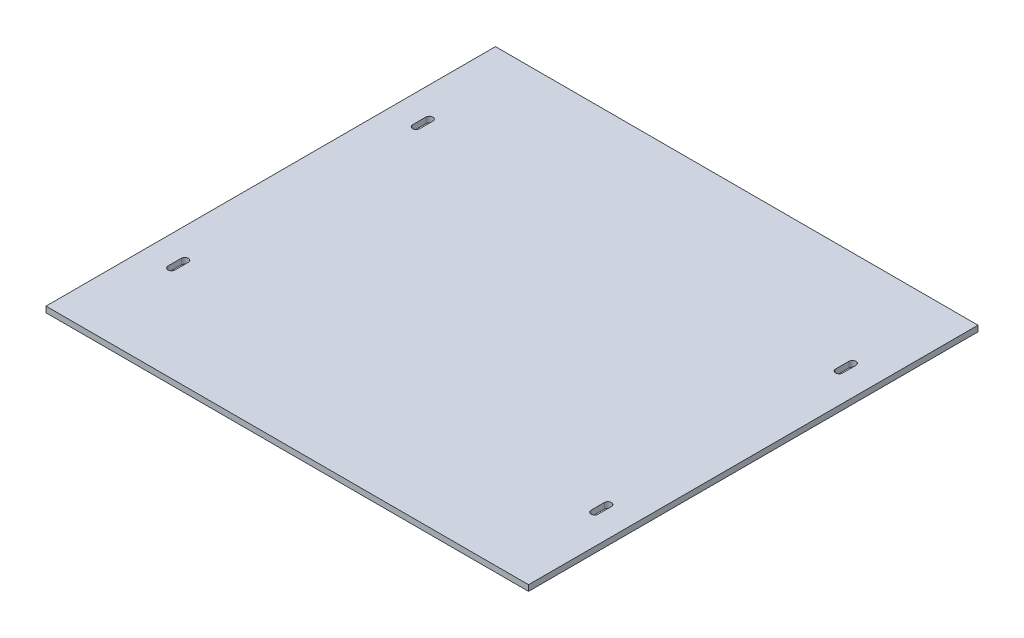
ISO-10303-21;
HEADER;
FILE_DESCRIPTION(('STEP AP214'),'2;1');
FILE_NAME('part.step','',(''),(''),'','','');
FILE_SCHEMA(('AUTOMOTIVE_DESIGN { 1 0 10303 214 1 1 1 1 }'));
ENDSEC;
DATA;
#1=APPLICATION_CONTEXT('core data for automotive mechanical design processes');
#2=APPLICATION_PROTOCOL_DEFINITION('international standard','automotive_design',2000,#1);
#3=PRODUCT_CONTEXT('',#1,'mechanical');
#4=PRODUCT('Part','Part','',(#3));
#5=PRODUCT_RELATED_PRODUCT_CATEGORY('part','',(#4));
#6=PRODUCT_DEFINITION_FORMATION('','',#4);
#7=PRODUCT_DEFINITION_CONTEXT('part definition',#1,'design');
#8=PRODUCT_DEFINITION('design','',#6,#7);
#9=PRODUCT_DEFINITION_SHAPE('','',#8);
#10=(LENGTH_UNIT() NAMED_UNIT(*) SI_UNIT(.MILLI.,.METRE.));
#11=(NAMED_UNIT(*) PLANE_ANGLE_UNIT() SI_UNIT($,.RADIAN.));
#12=(NAMED_UNIT(*) SI_UNIT($,.STERADIAN.) SOLID_ANGLE_UNIT());
#13=UNCERTAINTY_MEASURE_WITH_UNIT(LENGTH_MEASURE(1.E-05),#10,'distance_accuracy_value','');
#14=(GEOMETRIC_REPRESENTATION_CONTEXT(3) GLOBAL_UNCERTAINTY_ASSIGNED_CONTEXT((#13)) GLOBAL_UNIT_ASSIGNED_CONTEXT((#10,
#11,#12)) REPRESENTATION_CONTEXT('',''));
#15=CARTESIAN_POINT('',(0.,0.,0.));
#16=DIRECTION('',(0.,0.,1.));
#17=DIRECTION('',(1.,0.,0.));
#18=AXIS2_PLACEMENT_3D('',#15,#16,#17);
#19=CARTESIAN_POINT('',(0.,5.588,0.));
#20=DIRECTION('',(0.,-1.,0.));
#21=DIRECTION('',(0.,0.,-1.));
#22=AXIS2_PLACEMENT_3D('',#19,#20,#21);
#23=PLANE('',#22);
#24=CARTESIAN_POINT('',(434.975,5.588,-92.0749999999998));
#25=DIRECTION('',(0.,1.,0.));
#26=DIRECTION('',(0.,0.,1.));
#27=AXIS2_PLACEMENT_3D('',#24,#25,#26);
#28=CIRCLE('',#27,3.3782);
#29=CARTESIAN_POINT('',(431.5968,5.588,-92.0749999999998));
#30=VERTEX_POINT('',#29);
#31=CARTESIAN_POINT('',(438.3532,5.588,-92.0749999999998));
#32=VERTEX_POINT('',#31);
#33=EDGE_CURVE('E206',#30,#32,#28,.T.);
#34=ORIENTED_EDGE('',*,*,#33,.F.);
#35=DIRECTION('',(0.,0.,1.));
#36=VECTOR('',#35,1.);
#37=CARTESIAN_POINT('',(431.5968,5.588,-92.0749999999998));
#38=LINE('',#37,#36);
#39=CARTESIAN_POINT('',(431.5968,5.588,-104.775));
#40=VERTEX_POINT('',#39);
#41=EDGE_CURVE('E214',#40,#30,#38,.T.);
#42=ORIENTED_EDGE('',*,*,#41,.F.);
#43=CARTESIAN_POINT('',(434.975,5.588,-104.775));
#44=DIRECTION('',(0.,1.,0.));
#45=DIRECTION('',(0.,0.,1.));
#46=AXIS2_PLACEMENT_3D('',#43,#44,#45);
#47=CIRCLE('',#46,3.3782);
#48=CARTESIAN_POINT('',(438.3532,5.588,-104.775));
#49=VERTEX_POINT('',#48);
#50=EDGE_CURVE('E211',#49,#40,#47,.T.);
#51=ORIENTED_EDGE('',*,*,#50,.F.);
#52=DIRECTION('',(0.,0.,-1.));
#53=VECTOR('',#52,1.);
#54=CARTESIAN_POINT('',(438.3532,5.588,-92.0749999999998));
#55=LINE('',#54,#53);
#56=EDGE_CURVE('E208',#32,#49,#55,.T.);
#57=ORIENTED_EDGE('',*,*,#56,.F.);
#58=EDGE_LOOP('',(#34,#42,#51,#57));
#59=FACE_BOUND('',#58,.T.);
#60=CARTESIAN_POINT('',(28.575,5.588,-339.725));
#61=DIRECTION('',(0.,1.,0.));
#62=DIRECTION('',(0.,0.,1.));
#63=AXIS2_PLACEMENT_3D('',#60,#61,#62);
#64=CIRCLE('',#63,3.37819999999998);
#65=CARTESIAN_POINT('',(31.9532,5.588,-339.725));
#66=VERTEX_POINT('',#65);
#67=CARTESIAN_POINT('',(25.1968,5.588,-339.725));
#68=VERTEX_POINT('',#67);
#69=EDGE_CURVE('E268',#66,#68,#64,.T.);
#70=ORIENTED_EDGE('',*,*,#69,.F.);
#71=DIRECTION('',(0.,0.,-1.));
#72=VECTOR('',#71,1.);
#73=CARTESIAN_POINT('',(31.9532,5.588,-339.725));
#74=LINE('',#73,#72);
#75=CARTESIAN_POINT('',(31.9532,5.588,-327.025));
#76=VERTEX_POINT('',#75);
#77=EDGE_CURVE('E276',#76,#66,#74,.T.);
#78=ORIENTED_EDGE('',*,*,#77,.F.);
#79=CARTESIAN_POINT('',(28.575,5.588,-327.025));
#80=DIRECTION('',(0.,1.,0.));
#81=DIRECTION('',(0.,0.,1.));
#82=AXIS2_PLACEMENT_3D('',#79,#80,#81);
#83=CIRCLE('',#82,3.37819999999998);
#84=CARTESIAN_POINT('',(25.1968,5.588,-327.025));
#85=VERTEX_POINT('',#84);
#86=EDGE_CURVE('E273',#85,#76,#83,.T.);
#87=ORIENTED_EDGE('',*,*,#86,.F.);
#88=DIRECTION('',(0.,0.,1.));
#89=VECTOR('',#88,1.);
#90=CARTESIAN_POINT('',(25.1968,5.588,-339.725));
#91=LINE('',#90,#89);
#92=EDGE_CURVE('E270',#68,#85,#91,.T.);
#93=ORIENTED_EDGE('',*,*,#92,.F.);
#94=EDGE_LOOP('',(#70,#78,#87,#93));
#95=FACE_BOUND('',#94,.T.);
#96=DIRECTION('',(0.,0.,1.));
#97=VECTOR('',#96,1.);
#98=CARTESIAN_POINT('',(0.,5.588,0.));
#99=LINE('',#98,#97);
#100=CARTESIAN_POINT('',(0.,5.588,-431.8));
#101=VERTEX_POINT('',#100);
#102=CARTESIAN_POINT('',(0.,5.588,0.));
#103=VERTEX_POINT('',#102);
#104=EDGE_CURVE('E299',#101,#103,#99,.T.);
#105=ORIENTED_EDGE('',*,*,#104,.T.);
#106=DIRECTION('',(1.,0.,0.));
#107=VECTOR('',#106,1.);
#108=CARTESIAN_POINT('',(0.,5.588,0.));
#109=LINE('',#108,#107);
#110=CARTESIAN_POINT('',(463.55,5.588,0.));
#111=VERTEX_POINT('',#110);
#112=EDGE_CURVE('E302',#103,#111,#109,.T.);
#113=ORIENTED_EDGE('',*,*,#112,.T.);
#114=DIRECTION('',(0.,0.,-1.));
#115=VECTOR('',#114,1.);
#116=CARTESIAN_POINT('',(463.55,5.588,0.));
#117=LINE('',#116,#115);
#118=CARTESIAN_POINT('',(463.55,5.588,-431.8));
#119=VERTEX_POINT('',#118);
#120=EDGE_CURVE('E305',#111,#119,#117,.T.);
#121=ORIENTED_EDGE('',*,*,#120,.T.);
#122=DIRECTION('',(-1.,0.,0.));
#123=VECTOR('',#122,1.);
#124=CARTESIAN_POINT('',(0.,5.588,-431.8));
#125=LINE('',#124,#123);
#126=EDGE_CURVE('E307',#119,#101,#125,.T.);
#127=ORIENTED_EDGE('',*,*,#126,.T.);
#128=EDGE_LOOP('',(#105,#113,#121,#127));
#129=FACE_BOUND('',#128,.T.);
#130=CARTESIAN_POINT('',(28.575,5.588,-92.075));
#131=DIRECTION('',(0.,1.,0.));
#132=DIRECTION('',(0.,0.,-1.));
#133=AXIS2_PLACEMENT_3D('',#130,#131,#132);
#134=CIRCLE('',#133,3.37819999999998);
#135=CARTESIAN_POINT('',(25.1968,5.588,-92.0749999999998));
#136=VERTEX_POINT('',#135);
#137=CARTESIAN_POINT('',(31.9532,5.588,-92.075));
#138=VERTEX_POINT('',#137);
#139=EDGE_CURVE('E237',#136,#138,#134,.T.);
#140=ORIENTED_EDGE('',*,*,#139,.F.);
#141=DIRECTION('',(0.,0.,1.));
#142=VECTOR('',#141,1.);
#143=CARTESIAN_POINT('',(25.1968,5.588,-92.0749999999998));
#144=LINE('',#143,#142);
#145=CARTESIAN_POINT('',(25.1968,5.588,-104.775));
#146=VERTEX_POINT('',#145);
#147=EDGE_CURVE('E245',#146,#136,#144,.T.);
#148=ORIENTED_EDGE('',*,*,#147,.F.);
#149=CARTESIAN_POINT('',(28.575,5.588,-104.775));
#150=DIRECTION('',(0.,1.,0.));
#151=DIRECTION('',(0.,0.,-1.));
#152=AXIS2_PLACEMENT_3D('',#149,#150,#151);
#153=CIRCLE('',#152,3.37819999999998);
#154=CARTESIAN_POINT('',(31.9532,5.588,-104.775));
#155=VERTEX_POINT('',#154);
#156=EDGE_CURVE('E242',#155,#146,#153,.T.);
#157=ORIENTED_EDGE('',*,*,#156,.F.);
#158=DIRECTION('',(0.,0.,-1.));
#159=VECTOR('',#158,1.);
#160=CARTESIAN_POINT('',(31.9532,5.588,-92.075));
#161=LINE('',#160,#159);
#162=EDGE_CURVE('E239',#138,#155,#161,.T.);
#163=ORIENTED_EDGE('',*,*,#162,.F.);
#164=EDGE_LOOP('',(#140,#148,#157,#163));
#165=FACE_BOUND('',#164,.T.);
#166=CARTESIAN_POINT('',(434.975,5.588,-339.725));
#167=DIRECTION('',(0.,1.,0.));
#168=DIRECTION('',(0.,0.,-1.));
#169=AXIS2_PLACEMENT_3D('',#166,#167,#168);
#170=CIRCLE('',#169,3.3782);
#171=CARTESIAN_POINT('',(438.3532,5.588,-339.725));
#172=VERTEX_POINT('',#171);
#173=CARTESIAN_POINT('',(431.5968,5.588,-339.725));
#174=VERTEX_POINT('',#173);
#175=EDGE_CURVE('E170',#172,#174,#170,.T.);
#176=ORIENTED_EDGE('',*,*,#175,.F.);
#177=DIRECTION('',(0.,0.,-1.));
#178=VECTOR('',#177,1.);
#179=CARTESIAN_POINT('',(438.3532,5.588,-339.725));
#180=LINE('',#179,#178);
#181=CARTESIAN_POINT('',(438.3532,5.588,-327.025));
#182=VERTEX_POINT('',#181);
#183=EDGE_CURVE('E192',#182,#172,#180,.T.);
#184=ORIENTED_EDGE('',*,*,#183,.F.);
#185=CARTESIAN_POINT('',(434.975,5.588,-327.025));
#186=DIRECTION('',(0.,1.,0.));
#187=DIRECTION('',(0.,0.,-1.));
#188=AXIS2_PLACEMENT_3D('',#185,#186,#187);
#189=CIRCLE('',#188,3.3782);
#190=CARTESIAN_POINT('',(431.5968,5.588,-327.025));
#191=VERTEX_POINT('',#190);
#192=EDGE_CURVE('E190',#191,#182,#189,.T.);
#193=ORIENTED_EDGE('',*,*,#192,.F.);
#194=DIRECTION('',(0.,0.,1.));
#195=VECTOR('',#194,1.);
#196=CARTESIAN_POINT('',(431.5968,5.588,-339.725));
#197=LINE('',#196,#195);
#198=EDGE_CURVE('E178',#174,#191,#197,.T.);
#199=ORIENTED_EDGE('',*,*,#198,.F.);
#200=EDGE_LOOP('',(#176,#184,#193,#199));
#201=FACE_BOUND('',#200,.T.);
#202=ADVANCED_FACE('F33',(#59,#95,#129,#165,#201),#23,.F.);
#203=CARTESIAN_POINT('',(0.,0.,0.));
#204=DIRECTION('',(0.,-1.,0.));
#205=DIRECTION('',(0.,0.,-1.));
#206=AXIS2_PLACEMENT_3D('',#203,#204,#205);
#207=PLANE('',#206);
#208=DIRECTION('',(0.,0.,1.));
#209=VECTOR('',#208,1.);
#210=CARTESIAN_POINT('',(0.,0.,0.));
#211=LINE('',#210,#209);
#212=CARTESIAN_POINT('',(0.,0.,-431.8));
#213=VERTEX_POINT('',#212);
#214=CARTESIAN_POINT('',(0.,0.,0.));
#215=VERTEX_POINT('',#214);
#216=EDGE_CURVE('E298',#213,#215,#211,.T.);
#217=ORIENTED_EDGE('',*,*,#216,.F.);
#218=DIRECTION('',(-1.,0.,0.));
#219=VECTOR('',#218,1.);
#220=CARTESIAN_POINT('',(0.,0.,-431.8));
#221=LINE('',#220,#219);
#222=CARTESIAN_POINT('',(463.55,0.,-431.8));
#223=VERTEX_POINT('',#222);
#224=EDGE_CURVE('E303',#223,#213,#221,.T.);
#225=ORIENTED_EDGE('',*,*,#224,.F.);
#226=DIRECTION('',(0.,0.,-1.));
#227=VECTOR('',#226,1.);
#228=CARTESIAN_POINT('',(463.55,0.,0.));
#229=LINE('',#228,#227);
#230=CARTESIAN_POINT('',(463.55,0.,0.));
#231=VERTEX_POINT('',#230);
#232=EDGE_CURVE('E314',#231,#223,#229,.T.);
#233=ORIENTED_EDGE('',*,*,#232,.F.);
#234=DIRECTION('',(1.,0.,0.));
#235=VECTOR('',#234,1.);
#236=CARTESIAN_POINT('',(0.,0.,0.));
#237=LINE('',#236,#235);
#238=EDGE_CURVE('E312',#215,#231,#237,.T.);
#239=ORIENTED_EDGE('',*,*,#238,.F.);
#240=EDGE_LOOP('',(#217,#225,#233,#239));
#241=FACE_BOUND('',#240,.T.);
#242=DIRECTION('',(0.,0.,-1.));
#243=VECTOR('',#242,1.);
#244=CARTESIAN_POINT('',(31.9532,0.,-339.725));
#245=LINE('',#244,#243);
#246=CARTESIAN_POINT('',(31.9532,0.,-327.025));
#247=VERTEX_POINT('',#246);
#248=CARTESIAN_POINT('',(31.9532,0.,-339.725));
#249=VERTEX_POINT('',#248);
#250=EDGE_CURVE('E271',#247,#249,#245,.T.);
#251=ORIENTED_EDGE('',*,*,#250,.T.);
#252=CARTESIAN_POINT('',(28.575,0.,-339.725));
#253=DIRECTION('',(0.,1.,0.));
#254=DIRECTION('',(0.,0.,1.));
#255=AXIS2_PLACEMENT_3D('',#252,#253,#254);
#256=CIRCLE('',#255,3.37819999999998);
#257=CARTESIAN_POINT('',(25.1968,0.,-339.725));
#258=VERTEX_POINT('',#257);
#259=EDGE_CURVE('E267',#249,#258,#256,.T.);
#260=ORIENTED_EDGE('',*,*,#259,.T.);
#261=DIRECTION('',(0.,0.,1.));
#262=VECTOR('',#261,1.);
#263=CARTESIAN_POINT('',(25.1968,0.,-339.725));
#264=LINE('',#263,#262);
#265=CARTESIAN_POINT('',(25.1968,0.,-327.025));
#266=VERTEX_POINT('',#265);
#267=EDGE_CURVE('E281',#258,#266,#264,.T.);
#268=ORIENTED_EDGE('',*,*,#267,.T.);
#269=CARTESIAN_POINT('',(28.575,0.,-327.025));
#270=DIRECTION('',(0.,1.,0.));
#271=DIRECTION('',(0.,0.,1.));
#272=AXIS2_PLACEMENT_3D('',#269,#270,#271);
#273=CIRCLE('',#272,3.37819999999998);
#274=EDGE_CURVE('E284',#266,#247,#273,.T.);
#275=ORIENTED_EDGE('',*,*,#274,.T.);
#276=EDGE_LOOP('',(#251,#260,#268,#275));
#277=FACE_BOUND('',#276,.T.);
#278=DIRECTION('',(0.,0.,1.));
#279=VECTOR('',#278,1.);
#280=CARTESIAN_POINT('',(25.1968,0.,-92.0749999999998));
#281=LINE('',#280,#279);
#282=CARTESIAN_POINT('',(25.1968,0.,-104.775));
#283=VERTEX_POINT('',#282);
#284=CARTESIAN_POINT('',(25.1968,0.,-92.0749999999998));
#285=VERTEX_POINT('',#284);
#286=EDGE_CURVE('E240',#283,#285,#281,.T.);
#287=ORIENTED_EDGE('',*,*,#286,.T.);
#288=CARTESIAN_POINT('',(28.575,0.,-92.075));
#289=DIRECTION('',(0.,1.,0.));
#290=DIRECTION('',(0.,0.,-1.));
#291=AXIS2_PLACEMENT_3D('',#288,#289,#290);
#292=CIRCLE('',#291,3.37819999999998);
#293=CARTESIAN_POINT('',(31.9532,0.,-92.075));
#294=VERTEX_POINT('',#293);
#295=EDGE_CURVE('E236',#285,#294,#292,.T.);
#296=ORIENTED_EDGE('',*,*,#295,.T.);
#297=DIRECTION('',(0.,0.,-1.));
#298=VECTOR('',#297,1.);
#299=CARTESIAN_POINT('',(31.9532,0.,-92.075));
#300=LINE('',#299,#298);
#301=CARTESIAN_POINT('',(31.9532,0.,-104.775));
#302=VERTEX_POINT('',#301);
#303=EDGE_CURVE('E250',#294,#302,#300,.T.);
#304=ORIENTED_EDGE('',*,*,#303,.T.);
#305=CARTESIAN_POINT('',(28.575,0.,-104.775));
#306=DIRECTION('',(0.,1.,0.));
#307=DIRECTION('',(0.,0.,-1.));
#308=AXIS2_PLACEMENT_3D('',#305,#306,#307);
#309=CIRCLE('',#308,3.37819999999998);
#310=EDGE_CURVE('E253',#302,#283,#309,.T.);
#311=ORIENTED_EDGE('',*,*,#310,.T.);
#312=EDGE_LOOP('',(#287,#296,#304,#311));
#313=FACE_BOUND('',#312,.T.);
#314=DIRECTION('',(0.,0.,1.));
#315=VECTOR('',#314,1.);
#316=CARTESIAN_POINT('',(431.5968,0.,-92.0749999999998));
#317=LINE('',#316,#315);
#318=CARTESIAN_POINT('',(431.5968,0.,-104.775));
#319=VERTEX_POINT('',#318);
#320=CARTESIAN_POINT('',(431.5968,0.,-92.0749999999998));
#321=VERTEX_POINT('',#320);
#322=EDGE_CURVE('E209',#319,#321,#317,.T.);
#323=ORIENTED_EDGE('',*,*,#322,.T.);
#324=CARTESIAN_POINT('',(434.975,0.,-92.0749999999998));
#325=DIRECTION('',(0.,1.,0.));
#326=DIRECTION('',(0.,0.,1.));
#327=AXIS2_PLACEMENT_3D('',#324,#325,#326);
#328=CIRCLE('',#327,3.3782);
#329=CARTESIAN_POINT('',(438.3532,0.,-92.0749999999998));
#330=VERTEX_POINT('',#329);
#331=EDGE_CURVE('E186',#321,#330,#328,.T.);
#332=ORIENTED_EDGE('',*,*,#331,.T.);
#333=DIRECTION('',(0.,0.,-1.));
#334=VECTOR('',#333,1.);
#335=CARTESIAN_POINT('',(438.3532,0.,-92.0749999999998));
#336=LINE('',#335,#334);
#337=CARTESIAN_POINT('',(438.3532,0.,-104.775));
#338=VERTEX_POINT('',#337);
#339=EDGE_CURVE('E219',#330,#338,#336,.T.);
#340=ORIENTED_EDGE('',*,*,#339,.T.);
#341=CARTESIAN_POINT('',(434.975,0.,-104.775));
#342=DIRECTION('',(0.,1.,0.));
#343=DIRECTION('',(0.,0.,1.));
#344=AXIS2_PLACEMENT_3D('',#341,#342,#343);
#345=CIRCLE('',#344,3.3782);
#346=EDGE_CURVE('E222',#338,#319,#345,.T.);
#347=ORIENTED_EDGE('',*,*,#346,.T.);
#348=EDGE_LOOP('',(#323,#332,#340,#347));
#349=FACE_BOUND('',#348,.T.);
#350=DIRECTION('',(0.,0.,-1.));
#351=VECTOR('',#350,1.);
#352=CARTESIAN_POINT('',(438.3532,0.,-339.725));
#353=LINE('',#352,#351);
#354=CARTESIAN_POINT('',(438.3532,0.,-327.025));
#355=VERTEX_POINT('',#354);
#356=CARTESIAN_POINT('',(438.3532,0.,-339.725));
#357=VERTEX_POINT('',#356);
#358=EDGE_CURVE('E179',#355,#357,#353,.T.);
#359=ORIENTED_EDGE('',*,*,#358,.T.);
#360=CARTESIAN_POINT('',(434.975,0.,-339.725));
#361=DIRECTION('',(0.,1.,0.));
#362=DIRECTION('',(0.,0.,-1.));
#363=AXIS2_PLACEMENT_3D('',#360,#361,#362);
#364=CIRCLE('',#363,3.3782);
#365=CARTESIAN_POINT('',(431.5968,0.,-339.725));
#366=VERTEX_POINT('',#365);
#367=EDGE_CURVE('E56',#357,#366,#364,.T.);
#368=ORIENTED_EDGE('',*,*,#367,.T.);
#369=DIRECTION('',(0.,0.,1.));
#370=VECTOR('',#369,1.);
#371=CARTESIAN_POINT('',(431.5968,0.,-339.725));
#372=LINE('',#371,#370);
#373=CARTESIAN_POINT('',(431.5968,0.,-327.025));
#374=VERTEX_POINT('',#373);
#375=EDGE_CURVE('E185',#366,#374,#372,.T.);
#376=ORIENTED_EDGE('',*,*,#375,.T.);
#377=CARTESIAN_POINT('',(434.975,0.,-327.025));
#378=DIRECTION('',(0.,1.,0.));
#379=DIRECTION('',(0.,0.,-1.));
#380=AXIS2_PLACEMENT_3D('',#377,#378,#379);
#381=CIRCLE('',#380,3.3782);
#382=EDGE_CURVE('E198',#374,#355,#381,.T.);
#383=ORIENTED_EDGE('',*,*,#382,.T.);
#384=EDGE_LOOP('',(#359,#368,#376,#383));
#385=FACE_BOUND('',#384,.T.);
#386=ADVANCED_FACE('F332',(#241,#277,#313,#349,#385),#207,.T.);
#387=CARTESIAN_POINT('',(0.,5.588,0.));
#388=DIRECTION('',(1.,0.,0.));
#389=DIRECTION('',(0.,0.,-1.));
#390=AXIS2_PLACEMENT_3D('',#387,#388,#389);
#391=PLANE('',#390);
#392=ORIENTED_EDGE('',*,*,#216,.T.);
#393=DIRECTION('',(0.,-1.,0.));
#394=VECTOR('',#393,1.);
#395=CARTESIAN_POINT('',(0.,5.588,0.));
#396=LINE('',#395,#394);
#397=EDGE_CURVE('E11',#103,#215,#396,.T.);
#398=ORIENTED_EDGE('',*,*,#397,.F.);
#399=ORIENTED_EDGE('',*,*,#104,.F.);
#400=DIRECTION('',(0.,-1.,0.));
#401=VECTOR('',#400,1.);
#402=CARTESIAN_POINT('',(0.,5.588,-431.8));
#403=LINE('',#402,#401);
#404=EDGE_CURVE('E309',#101,#213,#403,.T.);
#405=ORIENTED_EDGE('',*,*,#404,.T.);
#406=EDGE_LOOP('',(#392,#398,#399,#405));
#407=FACE_BOUND('',#406,.T.);
#408=ADVANCED_FACE('F35',(#407),#391,.F.);
#409=CARTESIAN_POINT('',(0.,5.588,0.));
#410=DIRECTION('',(0.,0.,-1.));
#411=DIRECTION('',(-1.,0.,0.));
#412=AXIS2_PLACEMENT_3D('',#409,#410,#411);
#413=PLANE('',#412);
#414=ORIENTED_EDGE('',*,*,#238,.T.);
#415=DIRECTION('',(0.,-1.,0.));
#416=VECTOR('',#415,1.);
#417=CARTESIAN_POINT('',(463.55,5.588,0.));
#418=LINE('',#417,#416);
#419=EDGE_CURVE('E41',#111,#231,#418,.T.);
#420=ORIENTED_EDGE('',*,*,#419,.F.);
#421=ORIENTED_EDGE('',*,*,#112,.F.);
#422=ORIENTED_EDGE('',*,*,#397,.T.);
#423=EDGE_LOOP('',(#414,#420,#421,#422));
#424=FACE_BOUND('',#423,.T.);
#425=ADVANCED_FACE('F343',(#424),#413,.F.);
#426=CARTESIAN_POINT('',(463.55,5.588,0.));
#427=DIRECTION('',(-1.,0.,0.));
#428=DIRECTION('',(0.,0.,1.));
#429=AXIS2_PLACEMENT_3D('',#426,#427,#428);
#430=PLANE('',#429);
#431=ORIENTED_EDGE('',*,*,#232,.T.);
#432=DIRECTION('',(0.,-1.,0.));
#433=VECTOR('',#432,1.);
#434=CARTESIAN_POINT('',(463.55,5.588,-431.8));
#435=LINE('',#434,#433);
#436=EDGE_CURVE('E319',#119,#223,#435,.T.);
#437=ORIENTED_EDGE('',*,*,#436,.F.);
#438=ORIENTED_EDGE('',*,*,#120,.F.);
#439=ORIENTED_EDGE('',*,*,#419,.T.);
#440=EDGE_LOOP('',(#431,#437,#438,#439));
#441=FACE_BOUND('',#440,.T.);
#442=ADVANCED_FACE('F326',(#441),#430,.F.);
#443=CARTESIAN_POINT('',(0.,5.588,-431.8));
#444=DIRECTION('',(0.,0.,1.));
#445=DIRECTION('',(1.,0.,0.));
#446=AXIS2_PLACEMENT_3D('',#443,#444,#445);
#447=PLANE('',#446);
#448=ORIENTED_EDGE('',*,*,#224,.T.);
#449=ORIENTED_EDGE('',*,*,#404,.F.);
#450=ORIENTED_EDGE('',*,*,#126,.F.);
#451=ORIENTED_EDGE('',*,*,#436,.T.);
#452=EDGE_LOOP('',(#448,#449,#450,#451));
#453=FACE_BOUND('',#452,.T.);
#454=ADVANCED_FACE('F336',(#453),#447,.F.);
#455=CARTESIAN_POINT('',(28.575,5.588,-339.725));
#456=DIRECTION('',(0.,-1.,0.));
#457=DIRECTION('',(0.,0.,-1.));
#458=AXIS2_PLACEMENT_3D('',#455,#456,#457);
#459=CYLINDRICAL_SURFACE('',#458,3.37819999999998);
#460=ORIENTED_EDGE('',*,*,#259,.F.);
#461=DIRECTION('',(0.,-1.,0.));
#462=VECTOR('',#461,1.);
#463=CARTESIAN_POINT('',(31.9532,5.588,-339.725));
#464=LINE('',#463,#462);
#465=EDGE_CURVE('E278',#66,#249,#464,.T.);
#466=ORIENTED_EDGE('',*,*,#465,.F.);
#467=ORIENTED_EDGE('',*,*,#69,.T.);
#468=DIRECTION('',(0.,-1.,0.));
#469=VECTOR('',#468,1.);
#470=CARTESIAN_POINT('',(25.1968,5.588,-339.725));
#471=LINE('',#470,#469);
#472=EDGE_CURVE('E295',#68,#258,#471,.T.);
#473=ORIENTED_EDGE('',*,*,#472,.T.);
#474=EDGE_LOOP('',(#460,#466,#467,#473));
#475=FACE_BOUND('',#474,.T.);
#476=ADVANCED_FACE('F360',(#475),#459,.F.);
#477=CARTESIAN_POINT('',(25.1968,5.588,-339.725));
#478=DIRECTION('',(1.,0.,0.));
#479=DIRECTION('',(0.,0.,-1.));
#480=AXIS2_PLACEMENT_3D('',#477,#478,#479);
#481=PLANE('',#480);
#482=ORIENTED_EDGE('',*,*,#267,.F.);
#483=ORIENTED_EDGE('',*,*,#472,.F.);
#484=ORIENTED_EDGE('',*,*,#92,.T.);
#485=DIRECTION('',(0.,-1.,0.));
#486=VECTOR('',#485,1.);
#487=CARTESIAN_POINT('',(25.1968,5.588,-327.025));
#488=LINE('',#487,#486);
#489=EDGE_CURVE('E293',#85,#266,#488,.T.);
#490=ORIENTED_EDGE('',*,*,#489,.T.);
#491=EDGE_LOOP('',(#482,#483,#484,#490));
#492=FACE_BOUND('',#491,.T.);
#493=ADVANCED_FACE('F367',(#492),#481,.T.);
#494=CARTESIAN_POINT('',(28.575,5.588,-327.025));
#495=DIRECTION('',(0.,-1.,0.));
#496=DIRECTION('',(0.,0.,-1.));
#497=AXIS2_PLACEMENT_3D('',#494,#495,#496);
#498=CYLINDRICAL_SURFACE('',#497,3.37819999999998);
#499=ORIENTED_EDGE('',*,*,#274,.F.);
#500=ORIENTED_EDGE('',*,*,#489,.F.);
#501=ORIENTED_EDGE('',*,*,#86,.T.);
#502=DIRECTION('',(0.,-1.,0.));
#503=VECTOR('',#502,1.);
#504=CARTESIAN_POINT('',(31.9532,5.588,-327.025));
#505=LINE('',#504,#503);
#506=EDGE_CURVE('E291',#76,#247,#505,.T.);
#507=ORIENTED_EDGE('',*,*,#506,.T.);
#508=EDGE_LOOP('',(#499,#500,#501,#507));
#509=FACE_BOUND('',#508,.T.);
#510=ADVANCED_FACE('F372',(#509),#498,.F.);
#511=CARTESIAN_POINT('',(31.9532,5.588,-339.725));
#512=DIRECTION('',(-1.,0.,0.));
#513=DIRECTION('',(0.,0.,1.));
#514=AXIS2_PLACEMENT_3D('',#511,#512,#513);
#515=PLANE('',#514);
#516=ORIENTED_EDGE('',*,*,#250,.F.);
#517=ORIENTED_EDGE('',*,*,#506,.F.);
#518=ORIENTED_EDGE('',*,*,#77,.T.);
#519=ORIENTED_EDGE('',*,*,#465,.T.);
#520=EDGE_LOOP('',(#516,#517,#518,#519));
#521=FACE_BOUND('',#520,.T.);
#522=ADVANCED_FACE('F379',(#521),#515,.T.);
#523=CARTESIAN_POINT('',(28.575,5.588,-92.075));
#524=DIRECTION('',(0.,-1.,0.));
#525=DIRECTION('',(0.,0.,-1.));
#526=AXIS2_PLACEMENT_3D('',#523,#524,#525);
#527=CYLINDRICAL_SURFACE('',#526,3.37819999999998);
#528=ORIENTED_EDGE('',*,*,#295,.F.);
#529=DIRECTION('',(0.,-1.,0.));
#530=VECTOR('',#529,1.);
#531=CARTESIAN_POINT('',(25.1968,5.588,-92.0749999999998));
#532=LINE('',#531,#530);
#533=EDGE_CURVE('E247',#136,#285,#532,.T.);
#534=ORIENTED_EDGE('',*,*,#533,.F.);
#535=ORIENTED_EDGE('',*,*,#139,.T.);
#536=DIRECTION('',(0.,-1.,0.));
#537=VECTOR('',#536,1.);
#538=CARTESIAN_POINT('',(31.9532,5.588,-92.075));
#539=LINE('',#538,#537);
#540=EDGE_CURVE('E264',#138,#294,#539,.T.);
#541=ORIENTED_EDGE('',*,*,#540,.T.);
#542=EDGE_LOOP('',(#528,#534,#535,#541));
#543=FACE_BOUND('',#542,.T.);
#544=ADVANCED_FACE('F392',(#543),#527,.F.);
#545=CARTESIAN_POINT('',(31.9532,5.588,-92.075));
#546=DIRECTION('',(-1.,0.,0.));
#547=DIRECTION('',(0.,0.,1.));
#548=AXIS2_PLACEMENT_3D('',#545,#546,#547);
#549=PLANE('',#548);
#550=ORIENTED_EDGE('',*,*,#303,.F.);
#551=ORIENTED_EDGE('',*,*,#540,.F.);
#552=ORIENTED_EDGE('',*,*,#162,.T.);
#553=DIRECTION('',(0.,-1.,0.));
#554=VECTOR('',#553,1.);
#555=CARTESIAN_POINT('',(31.9532,5.588,-104.775));
#556=LINE('',#555,#554);
#557=EDGE_CURVE('E262',#155,#302,#556,.T.);
#558=ORIENTED_EDGE('',*,*,#557,.T.);
#559=EDGE_LOOP('',(#550,#551,#552,#558));
#560=FACE_BOUND('',#559,.T.);
#561=ADVANCED_FACE('F397',(#560),#549,.T.);
#562=CARTESIAN_POINT('',(28.575,5.588,-104.775));
#563=DIRECTION('',(0.,-1.,0.));
#564=DIRECTION('',(0.,0.,-1.));
#565=AXIS2_PLACEMENT_3D('',#562,#563,#564);
#566=CYLINDRICAL_SURFACE('',#565,3.37819999999998);
#567=ORIENTED_EDGE('',*,*,#310,.F.);
#568=ORIENTED_EDGE('',*,*,#557,.F.);
#569=ORIENTED_EDGE('',*,*,#156,.T.);
#570=DIRECTION('',(0.,-1.,0.));
#571=VECTOR('',#570,1.);
#572=CARTESIAN_POINT('',(25.1968,5.588,-104.775));
#573=LINE('',#572,#571);
#574=EDGE_CURVE('E260',#146,#283,#573,.T.);
#575=ORIENTED_EDGE('',*,*,#574,.T.);
#576=EDGE_LOOP('',(#567,#568,#569,#575));
#577=FACE_BOUND('',#576,.T.);
#578=ADVANCED_FACE('F401',(#577),#566,.F.);
#579=CARTESIAN_POINT('',(25.1968,5.588,-92.0749999999998));
#580=DIRECTION('',(1.,0.,0.));
#581=DIRECTION('',(0.,0.,-1.));
#582=AXIS2_PLACEMENT_3D('',#579,#580,#581);
#583=PLANE('',#582);
#584=ORIENTED_EDGE('',*,*,#286,.F.);
#585=ORIENTED_EDGE('',*,*,#574,.F.);
#586=ORIENTED_EDGE('',*,*,#147,.T.);
#587=ORIENTED_EDGE('',*,*,#533,.T.);
#588=EDGE_LOOP('',(#584,#585,#586,#587));
#589=FACE_BOUND('',#588,.T.);
#590=ADVANCED_FACE('F405',(#589),#583,.T.);
#591=CARTESIAN_POINT('',(434.975,5.588,-92.0749999999998));
#592=DIRECTION('',(0.,-1.,0.));
#593=DIRECTION('',(0.,0.,-1.));
#594=AXIS2_PLACEMENT_3D('',#591,#592,#593);
#595=CYLINDRICAL_SURFACE('',#594,3.3782);
#596=ORIENTED_EDGE('',*,*,#331,.F.);
#597=DIRECTION('',(0.,-1.,0.));
#598=VECTOR('',#597,1.);
#599=CARTESIAN_POINT('',(431.5968,5.588,-92.0749999999998));
#600=LINE('',#599,#598);
#601=EDGE_CURVE('E216',#30,#321,#600,.T.);
#602=ORIENTED_EDGE('',*,*,#601,.F.);
#603=ORIENTED_EDGE('',*,*,#33,.T.);
#604=DIRECTION('',(0.,-1.,0.));
#605=VECTOR('',#604,1.);
#606=CARTESIAN_POINT('',(438.3532,5.588,-92.0749999999998));
#607=LINE('',#606,#605);
#608=EDGE_CURVE('E233',#32,#330,#607,.T.);
#609=ORIENTED_EDGE('',*,*,#608,.T.);
#610=EDGE_LOOP('',(#596,#602,#603,#609));
#611=FACE_BOUND('',#610,.T.);
#612=ADVANCED_FACE('F409',(#611),#595,.F.);
#613=CARTESIAN_POINT('',(438.3532,5.588,-92.0749999999998));
#614=DIRECTION('',(-1.,0.,0.));
#615=DIRECTION('',(0.,0.,1.));
#616=AXIS2_PLACEMENT_3D('',#613,#614,#615);
#617=PLANE('',#616);
#618=ORIENTED_EDGE('',*,*,#339,.F.);
#619=ORIENTED_EDGE('',*,*,#608,.F.);
#620=ORIENTED_EDGE('',*,*,#56,.T.);
#621=DIRECTION('',(0.,-1.,0.));
#622=VECTOR('',#621,1.);
#623=CARTESIAN_POINT('',(438.3532,5.588,-104.775));
#624=LINE('',#623,#622);
#625=EDGE_CURVE('E231',#49,#338,#624,.T.);
#626=ORIENTED_EDGE('',*,*,#625,.T.);
#627=EDGE_LOOP('',(#618,#619,#620,#626));
#628=FACE_BOUND('',#627,.T.);
#629=ADVANCED_FACE('F413',(#628),#617,.T.);
#630=CARTESIAN_POINT('',(434.975,5.588,-104.775));
#631=DIRECTION('',(0.,-1.,0.));
#632=DIRECTION('',(0.,0.,-1.));
#633=AXIS2_PLACEMENT_3D('',#630,#631,#632);
#634=CYLINDRICAL_SURFACE('',#633,3.3782);
#635=ORIENTED_EDGE('',*,*,#346,.F.);
#636=ORIENTED_EDGE('',*,*,#625,.F.);
#637=ORIENTED_EDGE('',*,*,#50,.T.);
#638=DIRECTION('',(0.,-1.,0.));
#639=VECTOR('',#638,1.);
#640=CARTESIAN_POINT('',(431.5968,5.588,-104.775));
#641=LINE('',#640,#639);
#642=EDGE_CURVE('E229',#40,#319,#641,.T.);
#643=ORIENTED_EDGE('',*,*,#642,.T.);
#644=EDGE_LOOP('',(#635,#636,#637,#643));
#645=FACE_BOUND('',#644,.T.);
#646=ADVANCED_FACE('F417',(#645),#634,.F.);
#647=CARTESIAN_POINT('',(431.5968,5.588,-92.0749999999998));
#648=DIRECTION('',(1.,0.,0.));
#649=DIRECTION('',(0.,0.,-1.));
#650=AXIS2_PLACEMENT_3D('',#647,#648,#649);
#651=PLANE('',#650);
#652=ORIENTED_EDGE('',*,*,#322,.F.);
#653=ORIENTED_EDGE('',*,*,#642,.F.);
#654=ORIENTED_EDGE('',*,*,#41,.T.);
#655=ORIENTED_EDGE('',*,*,#601,.T.);
#656=EDGE_LOOP('',(#652,#653,#654,#655));
#657=FACE_BOUND('',#656,.T.);
#658=ADVANCED_FACE('F421',(#657),#651,.T.);
#659=CARTESIAN_POINT('',(434.975,5.588,-339.725));
#660=DIRECTION('',(0.,-1.,0.));
#661=DIRECTION('',(0.,0.,-1.));
#662=AXIS2_PLACEMENT_3D('',#659,#660,#661);
#663=CYLINDRICAL_SURFACE('',#662,3.3782);
#664=ORIENTED_EDGE('',*,*,#367,.F.);
#665=DIRECTION('',(0.,-1.,0.));
#666=VECTOR('',#665,1.);
#667=CARTESIAN_POINT('',(438.3532,5.588,-339.725));
#668=LINE('',#667,#666);
#669=EDGE_CURVE('E174',#172,#357,#668,.T.);
#670=ORIENTED_EDGE('',*,*,#669,.F.);
#671=ORIENTED_EDGE('',*,*,#175,.T.);
#672=DIRECTION('',(0.,-1.,0.));
#673=VECTOR('',#672,1.);
#674=CARTESIAN_POINT('',(431.5968,5.588,-339.725));
#675=LINE('',#674,#673);
#676=EDGE_CURVE('E173',#174,#366,#675,.T.);
#677=ORIENTED_EDGE('',*,*,#676,.T.);
#678=EDGE_LOOP('',(#664,#670,#671,#677));
#679=FACE_BOUND('',#678,.T.);
#680=ADVANCED_FACE('F172',(#679),#663,.F.);
#681=CARTESIAN_POINT('',(431.5968,5.588,-339.725));
#682=DIRECTION('',(1.,0.,0.));
#683=DIRECTION('',(0.,0.,-1.));
#684=AXIS2_PLACEMENT_3D('',#681,#682,#683);
#685=PLANE('',#684);
#686=ORIENTED_EDGE('',*,*,#375,.F.);
#687=ORIENTED_EDGE('',*,*,#676,.F.);
#688=ORIENTED_EDGE('',*,*,#198,.T.);
#689=DIRECTION('',(0.,-1.,0.));
#690=VECTOR('',#689,1.);
#691=CARTESIAN_POINT('',(431.5968,5.588,-327.025));
#692=LINE('',#691,#690);
#693=EDGE_CURVE('E187',#191,#374,#692,.T.);
#694=ORIENTED_EDGE('',*,*,#693,.T.);
#695=EDGE_LOOP('',(#686,#687,#688,#694));
#696=FACE_BOUND('',#695,.T.);
#697=ADVANCED_FACE('F182',(#696),#685,.T.);
#698=CARTESIAN_POINT('',(434.975,5.588,-327.025));
#699=DIRECTION('',(0.,-1.,0.));
#700=DIRECTION('',(0.,0.,-1.));
#701=AXIS2_PLACEMENT_3D('',#698,#699,#700);
#702=CYLINDRICAL_SURFACE('',#701,3.3782);
#703=ORIENTED_EDGE('',*,*,#382,.F.);
#704=ORIENTED_EDGE('',*,*,#693,.F.);
#705=ORIENTED_EDGE('',*,*,#192,.T.);
#706=DIRECTION('',(0.,-1.,0.));
#707=VECTOR('',#706,1.);
#708=CARTESIAN_POINT('',(438.3532,5.588,-327.025));
#709=LINE('',#708,#707);
#710=EDGE_CURVE('E48',#182,#355,#709,.T.);
#711=ORIENTED_EDGE('',*,*,#710,.T.);
#712=EDGE_LOOP('',(#703,#704,#705,#711));
#713=FACE_BOUND('',#712,.T.);
#714=ADVANCED_FACE('F430',(#713),#702,.F.);
#715=CARTESIAN_POINT('',(438.3532,5.588,-339.725));
#716=DIRECTION('',(-1.,0.,0.));
#717=DIRECTION('',(0.,0.,1.));
#718=AXIS2_PLACEMENT_3D('',#715,#716,#717);
#719=PLANE('',#718);
#720=ORIENTED_EDGE('',*,*,#358,.F.);
#721=ORIENTED_EDGE('',*,*,#710,.F.);
#722=ORIENTED_EDGE('',*,*,#183,.T.);
#723=ORIENTED_EDGE('',*,*,#669,.T.);
#724=EDGE_LOOP('',(#720,#721,#722,#723));
#725=FACE_BOUND('',#724,.T.);
#726=ADVANCED_FACE('F433',(#725),#719,.T.);
#727=CLOSED_SHELL('',(#202,#386,#408,#425,#442,#454,#476,#493,#510,#522,#544,#561,#578,#590,
#612,#629,#646,#658,#680,#697,#714,#726));
#728=MANIFOLD_SOLID_BREP('B2',#727);
#729=ADVANCED_BREP_SHAPE_REPRESENTATION('',(#18,#728),#14);
#730=SHAPE_DEFINITION_REPRESENTATION(#9,#729);
ENDSEC;
END-ISO-10303-21;
